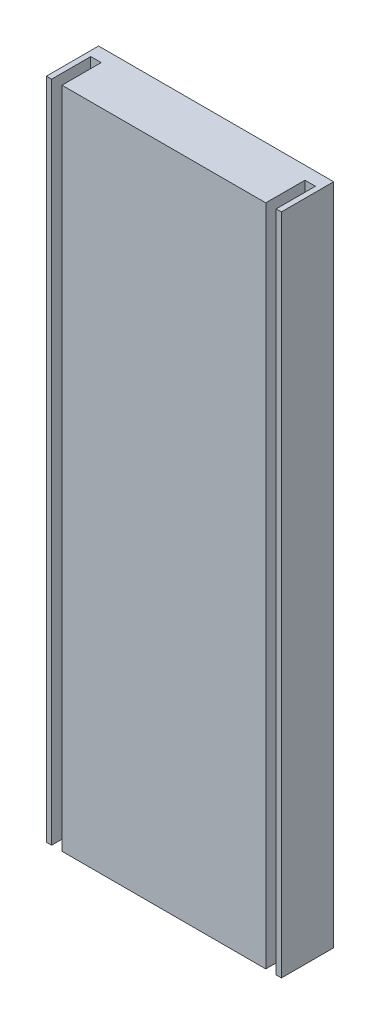
ISO-10303-21;
HEADER;
FILE_DESCRIPTION(('STEP AP214'),'2;1');
FILE_NAME('part.step','',(''),(''),'','','');
FILE_SCHEMA(('AUTOMOTIVE_DESIGN { 1 0 10303 214 1 1 1 1 }'));
ENDSEC;
DATA;
#1=APPLICATION_CONTEXT('core data for automotive mechanical design processes');
#2=APPLICATION_PROTOCOL_DEFINITION('international standard','automotive_design',2000,#1);
#3=PRODUCT_CONTEXT('',#1,'mechanical');
#4=PRODUCT('Part','Part','',(#3));
#5=PRODUCT_RELATED_PRODUCT_CATEGORY('part','',(#4));
#6=PRODUCT_DEFINITION_FORMATION('','',#4);
#7=PRODUCT_DEFINITION_CONTEXT('part definition',#1,'design');
#8=PRODUCT_DEFINITION('design','',#6,#7);
#9=PRODUCT_DEFINITION_SHAPE('','',#8);
#10=(LENGTH_UNIT() NAMED_UNIT(*) SI_UNIT(.MILLI.,.METRE.));
#11=(NAMED_UNIT(*) PLANE_ANGLE_UNIT() SI_UNIT($,.RADIAN.));
#12=(NAMED_UNIT(*) SI_UNIT($,.STERADIAN.) SOLID_ANGLE_UNIT());
#13=UNCERTAINTY_MEASURE_WITH_UNIT(LENGTH_MEASURE(1.E-05),#10,'distance_accuracy_value','');
#14=(GEOMETRIC_REPRESENTATION_CONTEXT(3) GLOBAL_UNCERTAINTY_ASSIGNED_CONTEXT((#13)) GLOBAL_UNIT_ASSIGNED_CONTEXT((#10,
#11,#12)) REPRESENTATION_CONTEXT('',''));
#15=CARTESIAN_POINT('',(0.,0.,0.));
#16=DIRECTION('',(0.,0.,1.));
#17=DIRECTION('',(1.,0.,0.));
#18=AXIS2_PLACEMENT_3D('',#15,#16,#17);
#19=CARTESIAN_POINT('',(-33.616298811545,254.,-12.7589134125637));
#20=DIRECTION('',(1.,0.,0.));
#21=DIRECTION('',(0.,0.,-1.));
#22=AXIS2_PLACEMENT_3D('',#19,#20,#21);
#23=PLANE('',#22);
#24=DIRECTION('',(0.,0.,1.));
#25=VECTOR('',#24,1.);
#26=CARTESIAN_POINT('',(-33.616298811545,0.,-12.7589134125637));
#27=LINE('',#26,#25);
#28=CARTESIAN_POINT('',(-33.616298811545,0.,-12.7589134125637));
#29=VERTEX_POINT('',#28);
#30=CARTESIAN_POINT('',(-33.616298811545,0.,7.24108658743634));
#31=VERTEX_POINT('',#30);
#32=EDGE_CURVE('E153',#29,#31,#27,.T.);
#33=ORIENTED_EDGE('',*,*,#32,.T.);
#34=DIRECTION('',(0.,-1.,0.));
#35=VECTOR('',#34,1.);
#36=CARTESIAN_POINT('',(-33.616298811545,254.,7.24108658743634));
#37=LINE('',#36,#35);
#38=CARTESIAN_POINT('',(-33.616298811545,254.,7.24108658743634));
#39=VERTEX_POINT('',#38);
#40=EDGE_CURVE('E11',#39,#31,#37,.T.);
#41=ORIENTED_EDGE('',*,*,#40,.F.);
#42=DIRECTION('',(0.,0.,1.));
#43=VECTOR('',#42,1.);
#44=CARTESIAN_POINT('',(-33.616298811545,254.,-12.7589134125637));
#45=LINE('',#44,#43);
#46=CARTESIAN_POINT('',(-33.616298811545,254.,-12.7589134125637));
#47=VERTEX_POINT('',#46);
#48=EDGE_CURVE('E175',#47,#39,#45,.T.);
#49=ORIENTED_EDGE('',*,*,#48,.F.);
#50=DIRECTION('',(0.,-1.,0.));
#51=VECTOR('',#50,1.);
#52=CARTESIAN_POINT('',(-33.616298811545,254.,-12.7589134125637));
#53=LINE('',#52,#51);
#54=EDGE_CURVE('E149',#47,#29,#53,.T.);
#55=ORIENTED_EDGE('',*,*,#54,.T.);
#56=EDGE_LOOP('',(#33,#41,#49,#55));
#57=FACE_BOUND('',#56,.T.);
#58=ADVANCED_FACE('F33',(#57),#23,.F.);
#59=CARTESIAN_POINT('',(-33.616298811545,254.,7.24108658743634));
#60=DIRECTION('',(0.,0.,-1.));
#61=DIRECTION('',(-1.,0.,0.));
#62=AXIS2_PLACEMENT_3D('',#59,#60,#61);
#63=PLANE('',#62);
#64=DIRECTION('',(1.,0.,0.));
#65=VECTOR('',#64,1.);
#66=CARTESIAN_POINT('',(-33.616298811545,0.,7.24108658743634));
#67=LINE('',#66,#65);
#68=CARTESIAN_POINT('',(-31.616298811545,0.,7.24108658743634));
#69=VERTEX_POINT('',#68);
#70=EDGE_CURVE('E156',#31,#69,#67,.T.);
#71=ORIENTED_EDGE('',*,*,#70,.T.);
#72=DIRECTION('',(0.,-1.,0.));
#73=VECTOR('',#72,1.);
#74=CARTESIAN_POINT('',(-31.616298811545,254.,7.24108658743634));
#75=LINE('',#74,#73);
#76=CARTESIAN_POINT('',(-31.616298811545,254.,7.24108658743634));
#77=VERTEX_POINT('',#76);
#78=EDGE_CURVE('E41',#77,#69,#75,.T.);
#79=ORIENTED_EDGE('',*,*,#78,.F.);
#80=DIRECTION('',(1.,0.,0.));
#81=VECTOR('',#80,1.);
#82=CARTESIAN_POINT('',(-33.616298811545,254.,7.24108658743634));
#83=LINE('',#82,#81);
#84=EDGE_CURVE('E104',#39,#77,#83,.T.);
#85=ORIENTED_EDGE('',*,*,#84,.F.);
#86=ORIENTED_EDGE('',*,*,#40,.T.);
#87=EDGE_LOOP('',(#71,#79,#85,#86));
#88=FACE_BOUND('',#87,.T.);
#89=ADVANCED_FACE('F253',(#88),#63,.F.);
#90=CARTESIAN_POINT('',(-31.616298811545,254.,7.24108658743634));
#91=DIRECTION('',(-1.,0.,0.));
#92=DIRECTION('',(0.,0.,1.));
#93=AXIS2_PLACEMENT_3D('',#90,#91,#92);
#94=PLANE('',#93);
#95=DIRECTION('',(0.,0.,-1.));
#96=VECTOR('',#95,1.);
#97=CARTESIAN_POINT('',(-31.616298811545,0.,7.24108658743634));
#98=LINE('',#97,#96);
#99=CARTESIAN_POINT('',(-31.616298811545,0.,-7.75891341256366));
#100=VERTEX_POINT('',#99);
#101=EDGE_CURVE('E158',#69,#100,#98,.T.);
#102=ORIENTED_EDGE('',*,*,#101,.T.);
#103=DIRECTION('',(0.,-1.,0.));
#104=VECTOR('',#103,1.);
#105=CARTESIAN_POINT('',(-31.616298811545,254.,-7.75891341256366));
#106=LINE('',#105,#104);
#107=CARTESIAN_POINT('',(-31.616298811545,254.,-7.75891341256366));
#108=VERTEX_POINT('',#107);
#109=EDGE_CURVE('E194',#108,#100,#106,.T.);
#110=ORIENTED_EDGE('',*,*,#109,.F.);
#111=DIRECTION('',(0.,0.,-1.));
#112=VECTOR('',#111,1.);
#113=CARTESIAN_POINT('',(-31.616298811545,254.,7.24108658743634));
#114=LINE('',#113,#112);
#115=EDGE_CURVE('E202',#77,#108,#114,.T.);
#116=ORIENTED_EDGE('',*,*,#115,.F.);
#117=ORIENTED_EDGE('',*,*,#78,.T.);
#118=EDGE_LOOP('',(#102,#110,#116,#117));
#119=FACE_BOUND('',#118,.T.);
#120=ADVANCED_FACE('F200',(#119),#94,.F.);
#121=CARTESIAN_POINT('',(-31.616298811545,254.,-7.75891341256366));
#122=DIRECTION('',(0.,0.,-1.));
#123=DIRECTION('',(-1.,0.,0.));
#124=AXIS2_PLACEMENT_3D('',#121,#122,#123);
#125=PLANE('',#124);
#126=DIRECTION('',(1.,0.,0.));
#127=VECTOR('',#126,1.);
#128=CARTESIAN_POINT('',(-31.616298811545,0.,-7.75891341256366));
#129=LINE('',#128,#127);
#130=CARTESIAN_POINT('',(-27.616298811545,0.,-7.75891341256366));
#131=VERTEX_POINT('',#130);
#132=EDGE_CURVE('E160',#100,#131,#129,.T.);
#133=ORIENTED_EDGE('',*,*,#132,.T.);
#134=DIRECTION('',(0.,-1.,0.));
#135=VECTOR('',#134,1.);
#136=CARTESIAN_POINT('',(-27.616298811545,254.,-7.75891341256366));
#137=LINE('',#136,#135);
#138=CARTESIAN_POINT('',(-27.616298811545,254.,-7.75891341256366));
#139=VERTEX_POINT('',#138);
#140=EDGE_CURVE('E191',#139,#131,#137,.T.);
#141=ORIENTED_EDGE('',*,*,#140,.F.);
#142=DIRECTION('',(1.,0.,0.));
#143=VECTOR('',#142,1.);
#144=CARTESIAN_POINT('',(-31.616298811545,254.,-7.75891341256366));
#145=LINE('',#144,#143);
#146=EDGE_CURVE('E220',#108,#139,#145,.T.);
#147=ORIENTED_EDGE('',*,*,#146,.F.);
#148=ORIENTED_EDGE('',*,*,#109,.T.);
#149=EDGE_LOOP('',(#133,#141,#147,#148));
#150=FACE_BOUND('',#149,.T.);
#151=ADVANCED_FACE('F211',(#150),#125,.F.);
#152=CARTESIAN_POINT('',(-27.616298811545,254.,-7.75891341256366));
#153=DIRECTION('',(1.,0.,0.));
#154=DIRECTION('',(0.,0.,-1.));
#155=AXIS2_PLACEMENT_3D('',#152,#153,#154);
#156=PLANE('',#155);
#157=DIRECTION('',(0.,0.,1.));
#158=VECTOR('',#157,1.);
#159=CARTESIAN_POINT('',(-27.616298811545,0.,-7.75891341256366));
#160=LINE('',#159,#158);
#161=CARTESIAN_POINT('',(-27.616298811545,0.,7.24108658743634));
#162=VERTEX_POINT('',#161);
#163=EDGE_CURVE('E162',#131,#162,#160,.T.);
#164=ORIENTED_EDGE('',*,*,#163,.T.);
#165=DIRECTION('',(0.,-1.,0.));
#166=VECTOR('',#165,1.);
#167=CARTESIAN_POINT('',(-27.616298811545,254.,7.24108658743634));
#168=LINE('',#167,#166);
#169=CARTESIAN_POINT('',(-27.616298811545,254.,7.24108658743634));
#170=VERTEX_POINT('',#169);
#171=EDGE_CURVE('E188',#170,#162,#168,.T.);
#172=ORIENTED_EDGE('',*,*,#171,.F.);
#173=DIRECTION('',(0.,0.,1.));
#174=VECTOR('',#173,1.);
#175=CARTESIAN_POINT('',(-27.616298811545,254.,-7.75891341256366));
#176=LINE('',#175,#174);
#177=EDGE_CURVE('E217',#139,#170,#176,.T.);
#178=ORIENTED_EDGE('',*,*,#177,.F.);
#179=ORIENTED_EDGE('',*,*,#140,.T.);
#180=EDGE_LOOP('',(#164,#172,#178,#179));
#181=FACE_BOUND('',#180,.T.);
#182=ADVANCED_FACE('F215',(#181),#156,.F.);
#183=CARTESIAN_POINT('',(-27.616298811545,254.,7.24108658743634));
#184=DIRECTION('',(0.,0.,-1.));
#185=DIRECTION('',(-1.,0.,0.));
#186=AXIS2_PLACEMENT_3D('',#183,#184,#185);
#187=PLANE('',#186);
#188=DIRECTION('',(1.,0.,0.));
#189=VECTOR('',#188,1.);
#190=CARTESIAN_POINT('',(-27.616298811545,0.,7.24108658743634));
#191=LINE('',#190,#189);
#192=CARTESIAN_POINT('',(50.383701188455,0.,7.24108658743633));
#193=VERTEX_POINT('',#192);
#194=EDGE_CURVE('E164',#162,#193,#191,.T.);
#195=ORIENTED_EDGE('',*,*,#194,.T.);
#196=DIRECTION('',(0.,-1.,0.));
#197=VECTOR('',#196,1.);
#198=CARTESIAN_POINT('',(50.383701188455,254.,7.24108658743633));
#199=LINE('',#198,#197);
#200=CARTESIAN_POINT('',(50.383701188455,254.,7.24108658743633));
#201=VERTEX_POINT('',#200);
#202=EDGE_CURVE('E185',#201,#193,#199,.T.);
#203=ORIENTED_EDGE('',*,*,#202,.F.);
#204=DIRECTION('',(1.,0.,0.));
#205=VECTOR('',#204,1.);
#206=CARTESIAN_POINT('',(-27.616298811545,254.,7.24108658743634));
#207=LINE('',#206,#205);
#208=EDGE_CURVE('E219',#170,#201,#207,.T.);
#209=ORIENTED_EDGE('',*,*,#208,.F.);
#210=ORIENTED_EDGE('',*,*,#171,.T.);
#211=EDGE_LOOP('',(#195,#203,#209,#210));
#212=FACE_BOUND('',#211,.T.);
#213=ADVANCED_FACE('F266',(#212),#187,.F.);
#214=CARTESIAN_POINT('',(50.383701188455,254.,-7.75891341256366));
#215=DIRECTION('',(-1.,0.,0.));
#216=DIRECTION('',(0.,0.,1.));
#217=AXIS2_PLACEMENT_3D('',#214,#215,#216);
#218=PLANE('',#217);
#219=DIRECTION('',(0.,0.,-1.));
#220=VECTOR('',#219,1.);
#221=CARTESIAN_POINT('',(50.383701188455,0.,-7.75891341256366));
#222=LINE('',#221,#220);
#223=CARTESIAN_POINT('',(50.383701188455,0.,-7.75891341256366));
#224=VERTEX_POINT('',#223);
#225=EDGE_CURVE('E166',#193,#224,#222,.T.);
#226=ORIENTED_EDGE('',*,*,#225,.T.);
#227=DIRECTION('',(0.,-1.,0.));
#228=VECTOR('',#227,1.);
#229=CARTESIAN_POINT('',(50.383701188455,254.,-7.75891341256366));
#230=LINE('',#229,#228);
#231=CARTESIAN_POINT('',(50.383701188455,254.,-7.75891341256366));
#232=VERTEX_POINT('',#231);
#233=EDGE_CURVE('E182',#232,#224,#230,.T.);
#234=ORIENTED_EDGE('',*,*,#233,.F.);
#235=DIRECTION('',(0.,0.,-1.));
#236=VECTOR('',#235,1.);
#237=CARTESIAN_POINT('',(50.383701188455,254.,-7.75891341256366));
#238=LINE('',#237,#236);
#239=EDGE_CURVE('E222',#201,#232,#238,.T.);
#240=ORIENTED_EDGE('',*,*,#239,.F.);
#241=ORIENTED_EDGE('',*,*,#202,.T.);
#242=EDGE_LOOP('',(#226,#234,#240,#241));
#243=FACE_BOUND('',#242,.T.);
#244=ADVANCED_FACE('F269',(#243),#218,.F.);
#245=CARTESIAN_POINT('',(54.383701188455,254.,-7.75891341256366));
#246=DIRECTION('',(0.,0.,-1.));
#247=DIRECTION('',(-1.,0.,0.));
#248=AXIS2_PLACEMENT_3D('',#245,#246,#247);
#249=PLANE('',#248);
#250=DIRECTION('',(1.,0.,0.));
#251=VECTOR('',#250,1.);
#252=CARTESIAN_POINT('',(54.383701188455,0.,-7.75891341256366));
#253=LINE('',#252,#251);
#254=CARTESIAN_POINT('',(54.383701188455,0.,-7.75891341256366));
#255=VERTEX_POINT('',#254);
#256=EDGE_CURVE('E168',#224,#255,#253,.T.);
#257=ORIENTED_EDGE('',*,*,#256,.T.);
#258=DIRECTION('',(0.,-1.,0.));
#259=VECTOR('',#258,1.);
#260=CARTESIAN_POINT('',(54.383701188455,254.,-7.75891341256366));
#261=LINE('',#260,#259);
#262=CARTESIAN_POINT('',(54.383701188455,254.,-7.75891341256366));
#263=VERTEX_POINT('',#262);
#264=EDGE_CURVE('E179',#263,#255,#261,.T.);
#265=ORIENTED_EDGE('',*,*,#264,.F.);
#266=DIRECTION('',(1.,0.,0.));
#267=VECTOR('',#266,1.);
#268=CARTESIAN_POINT('',(54.383701188455,254.,-7.75891341256366));
#269=LINE('',#268,#267);
#270=EDGE_CURVE('E228',#232,#263,#269,.T.);
#271=ORIENTED_EDGE('',*,*,#270,.F.);
#272=ORIENTED_EDGE('',*,*,#233,.T.);
#273=EDGE_LOOP('',(#257,#265,#271,#272));
#274=FACE_BOUND('',#273,.T.);
#275=ADVANCED_FACE('F234',(#274),#249,.F.);
#276=CARTESIAN_POINT('',(54.383701188455,254.,7.24108658743634));
#277=DIRECTION('',(1.,0.,0.));
#278=DIRECTION('',(0.,0.,-1.));
#279=AXIS2_PLACEMENT_3D('',#276,#277,#278);
#280=PLANE('',#279);
#281=DIRECTION('',(0.,0.,1.));
#282=VECTOR('',#281,1.);
#283=CARTESIAN_POINT('',(54.383701188455,0.,7.24108658743634));
#284=LINE('',#283,#282);
#285=CARTESIAN_POINT('',(54.383701188455,0.,7.24108658743634));
#286=VERTEX_POINT('',#285);
#287=EDGE_CURVE('E170',#255,#286,#284,.T.);
#288=ORIENTED_EDGE('',*,*,#287,.T.);
#289=DIRECTION('',(0.,-1.,0.));
#290=VECTOR('',#289,1.);
#291=CARTESIAN_POINT('',(54.383701188455,254.,7.24108658743634));
#292=LINE('',#291,#290);
#293=CARTESIAN_POINT('',(54.383701188455,254.,7.24108658743634));
#294=VERTEX_POINT('',#293);
#295=EDGE_CURVE('E144',#294,#286,#292,.T.);
#296=ORIENTED_EDGE('',*,*,#295,.F.);
#297=DIRECTION('',(0.,0.,1.));
#298=VECTOR('',#297,1.);
#299=CARTESIAN_POINT('',(54.383701188455,254.,7.24108658743634));
#300=LINE('',#299,#298);
#301=EDGE_CURVE('E135',#263,#294,#300,.T.);
#302=ORIENTED_EDGE('',*,*,#301,.F.);
#303=ORIENTED_EDGE('',*,*,#264,.T.);
#304=EDGE_LOOP('',(#288,#296,#302,#303));
#305=FACE_BOUND('',#304,.T.);
#306=ADVANCED_FACE('F238',(#305),#280,.F.);
#307=CARTESIAN_POINT('',(54.383701188455,254.,7.24108658743634));
#308=DIRECTION('',(0.,0.,-1.));
#309=DIRECTION('',(-1.,0.,0.));
#310=AXIS2_PLACEMENT_3D('',#307,#308,#309);
#311=PLANE('',#310);
#312=DIRECTION('',(1.,0.,0.));
#313=VECTOR('',#312,1.);
#314=CARTESIAN_POINT('',(54.383701188455,0.,7.24108658743634));
#315=LINE('',#314,#313);
#316=CARTESIAN_POINT('',(56.383701188455,0.,7.24108658743634));
#317=VERTEX_POINT('',#316);
#318=EDGE_CURVE('E143',#286,#317,#315,.T.);
#319=ORIENTED_EDGE('',*,*,#318,.T.);
#320=DIRECTION('',(0.,-1.,0.));
#321=VECTOR('',#320,1.);
#322=CARTESIAN_POINT('',(56.383701188455,254.,7.24108658743634));
#323=LINE('',#322,#321);
#324=CARTESIAN_POINT('',(56.383701188455,254.,7.24108658743634));
#325=VERTEX_POINT('',#324);
#326=EDGE_CURVE('E140',#325,#317,#323,.T.);
#327=ORIENTED_EDGE('',*,*,#326,.F.);
#328=DIRECTION('',(1.,0.,0.));
#329=VECTOR('',#328,1.);
#330=CARTESIAN_POINT('',(54.383701188455,254.,7.24108658743634));
#331=LINE('',#330,#329);
#332=EDGE_CURVE('E129',#294,#325,#331,.T.);
#333=ORIENTED_EDGE('',*,*,#332,.F.);
#334=ORIENTED_EDGE('',*,*,#295,.T.);
#335=EDGE_LOOP('',(#319,#327,#333,#334));
#336=FACE_BOUND('',#335,.T.);
#337=ADVANCED_FACE('F141',(#336),#311,.F.);
#338=CARTESIAN_POINT('',(56.383701188455,254.,-12.7589134125637));
#339=DIRECTION('',(-1.,0.,0.));
#340=DIRECTION('',(0.,0.,1.));
#341=AXIS2_PLACEMENT_3D('',#338,#339,#340);
#342=PLANE('',#341);
#343=DIRECTION('',(0.,0.,-1.));
#344=VECTOR('',#343,1.);
#345=CARTESIAN_POINT('',(56.383701188455,0.,-12.7589134125637));
#346=LINE('',#345,#344);
#347=CARTESIAN_POINT('',(56.383701188455,0.,-12.7589134125637));
#348=VERTEX_POINT('',#347);
#349=EDGE_CURVE('E90',#317,#348,#346,.T.);
#350=ORIENTED_EDGE('',*,*,#349,.T.);
#351=DIRECTION('',(0.,-1.,0.));
#352=VECTOR('',#351,1.);
#353=CARTESIAN_POINT('',(56.383701188455,254.,-12.7589134125637));
#354=LINE('',#353,#352);
#355=CARTESIAN_POINT('',(56.383701188455,254.,-12.7589134125637));
#356=VERTEX_POINT('',#355);
#357=EDGE_CURVE('E145',#356,#348,#354,.T.);
#358=ORIENTED_EDGE('',*,*,#357,.F.);
#359=DIRECTION('',(0.,0.,-1.));
#360=VECTOR('',#359,1.);
#361=CARTESIAN_POINT('',(56.383701188455,254.,-12.7589134125637));
#362=LINE('',#361,#360);
#363=EDGE_CURVE('E133',#325,#356,#362,.T.);
#364=ORIENTED_EDGE('',*,*,#363,.F.);
#365=ORIENTED_EDGE('',*,*,#326,.T.);
#366=EDGE_LOOP('',(#350,#358,#364,#365));
#367=FACE_BOUND('',#366,.T.);
#368=ADVANCED_FACE('F147',(#367),#342,.F.);
#369=CARTESIAN_POINT('',(-33.616298811545,254.,-12.7589134125637));
#370=DIRECTION('',(0.,0.,1.));
#371=DIRECTION('',(1.,0.,0.));
#372=AXIS2_PLACEMENT_3D('',#369,#370,#371);
#373=PLANE('',#372);
#374=DIRECTION('',(-1.,0.,0.));
#375=VECTOR('',#374,1.);
#376=CARTESIAN_POINT('',(-33.616298811545,0.,-12.7589134125637));
#377=LINE('',#376,#375);
#378=EDGE_CURVE('E96',#348,#29,#377,.T.);
#379=ORIENTED_EDGE('',*,*,#378,.T.);
#380=ORIENTED_EDGE('',*,*,#54,.F.);
#381=DIRECTION('',(-1.,0.,0.));
#382=VECTOR('',#381,1.);
#383=CARTESIAN_POINT('',(-33.616298811545,254.,-12.7589134125637));
#384=LINE('',#383,#382);
#385=EDGE_CURVE('E49',#356,#47,#384,.T.);
#386=ORIENTED_EDGE('',*,*,#385,.F.);
#387=ORIENTED_EDGE('',*,*,#357,.T.);
#388=EDGE_LOOP('',(#379,#380,#386,#387));
#389=FACE_BOUND('',#388,.T.);
#390=ADVANCED_FACE('F242',(#389),#373,.F.);
#391=CARTESIAN_POINT('',(0.,254.,0.));
#392=DIRECTION('',(0.,1.,0.));
#393=DIRECTION('',(0.,0.,1.));
#394=AXIS2_PLACEMENT_3D('',#391,#392,#393);
#395=PLANE('',#394);
#396=ORIENTED_EDGE('',*,*,#48,.T.);
#397=ORIENTED_EDGE('',*,*,#84,.T.);
#398=ORIENTED_EDGE('',*,*,#115,.T.);
#399=ORIENTED_EDGE('',*,*,#146,.T.);
#400=ORIENTED_EDGE('',*,*,#177,.T.);
#401=ORIENTED_EDGE('',*,*,#208,.T.);
#402=ORIENTED_EDGE('',*,*,#239,.T.);
#403=ORIENTED_EDGE('',*,*,#270,.T.);
#404=ORIENTED_EDGE('',*,*,#301,.T.);
#405=ORIENTED_EDGE('',*,*,#332,.T.);
#406=ORIENTED_EDGE('',*,*,#363,.T.);
#407=ORIENTED_EDGE('',*,*,#385,.T.);
#408=EDGE_LOOP('',(#396,#397,#398,#399,#400,#401,#402,#403,#404,#405,#406,#407));
#409=FACE_BOUND('',#408,.T.);
#410=ADVANCED_FACE('F131',(#409),#395,.T.);
#411=CARTESIAN_POINT('',(0.,0.,0.));
#412=DIRECTION('',(0.,1.,0.));
#413=DIRECTION('',(0.,0.,1.));
#414=AXIS2_PLACEMENT_3D('',#411,#412,#413);
#415=PLANE('',#414);
#416=ORIENTED_EDGE('',*,*,#32,.F.);
#417=ORIENTED_EDGE('',*,*,#378,.F.);
#418=ORIENTED_EDGE('',*,*,#349,.F.);
#419=ORIENTED_EDGE('',*,*,#318,.F.);
#420=ORIENTED_EDGE('',*,*,#287,.F.);
#421=ORIENTED_EDGE('',*,*,#256,.F.);
#422=ORIENTED_EDGE('',*,*,#225,.F.);
#423=ORIENTED_EDGE('',*,*,#194,.F.);
#424=ORIENTED_EDGE('',*,*,#163,.F.);
#425=ORIENTED_EDGE('',*,*,#132,.F.);
#426=ORIENTED_EDGE('',*,*,#101,.F.);
#427=ORIENTED_EDGE('',*,*,#70,.F.);
#428=EDGE_LOOP('',(#416,#417,#418,#419,#420,#421,#422,#423,#424,#425,#426,#427));
#429=FACE_BOUND('',#428,.T.);
#430=ADVANCED_FACE('F206',(#429),#415,.F.);
#431=CLOSED_SHELL('',(#58,#89,#120,#151,#182,#213,#244,#275,#306,#337,#368,#390,#410,#430));
#432=MANIFOLD_SOLID_BREP('B2',#431);
#433=ADVANCED_BREP_SHAPE_REPRESENTATION('',(#18,#432),#14);
#434=SHAPE_DEFINITION_REPRESENTATION(#9,#433);
ENDSEC;
END-ISO-10303-21;
